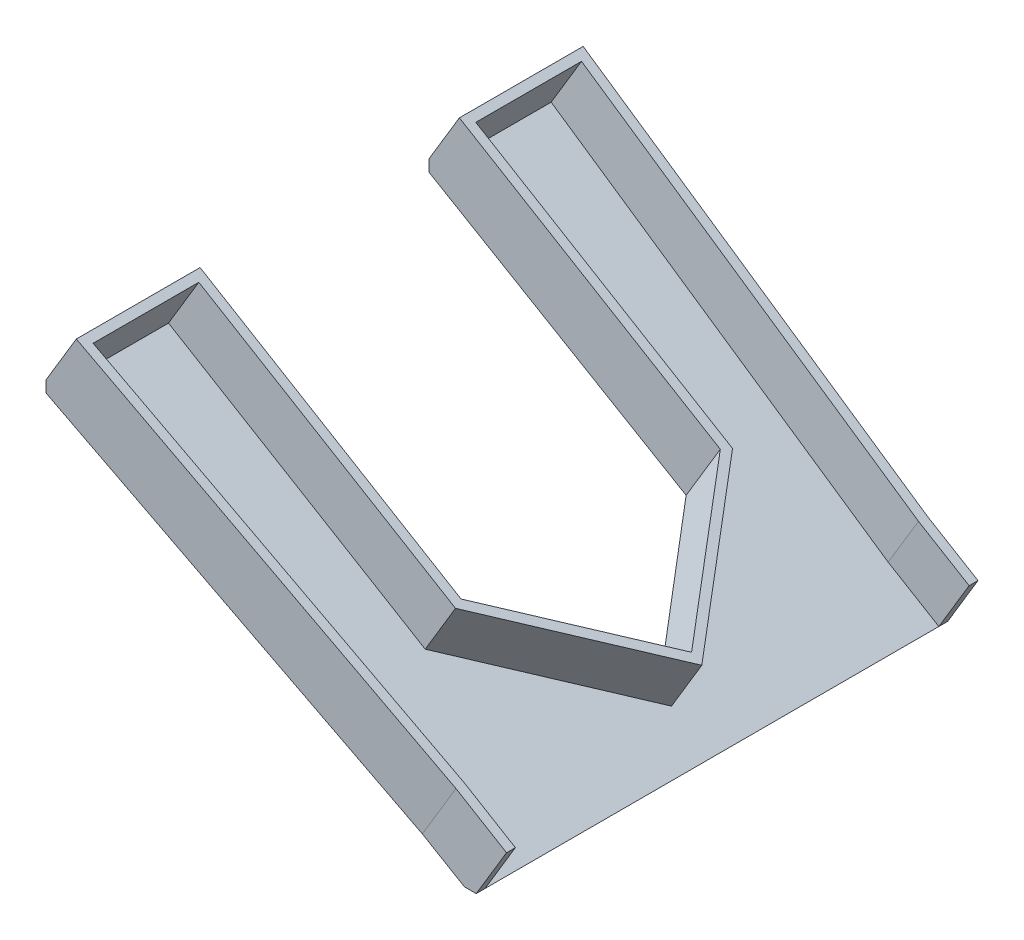
ISO-10303-21;
HEADER;
FILE_DESCRIPTION(('STEP AP214'),'2;1');
FILE_NAME('part.step','',(''),(''),'','','');
FILE_SCHEMA(('AUTOMOTIVE_DESIGN { 1 0 10303 214 1 1 1 1 }'));
ENDSEC;
DATA;
#1=APPLICATION_CONTEXT('core data for automotive mechanical design processes');
#2=APPLICATION_PROTOCOL_DEFINITION('international standard','automotive_design',2000,#1);
#3=PRODUCT_CONTEXT('',#1,'mechanical');
#4=PRODUCT('Part','Part','',(#3));
#5=PRODUCT_RELATED_PRODUCT_CATEGORY('part','',(#4));
#6=PRODUCT_DEFINITION_FORMATION('','',#4);
#7=PRODUCT_DEFINITION_CONTEXT('part definition',#1,'design');
#8=PRODUCT_DEFINITION('design','',#6,#7);
#9=PRODUCT_DEFINITION_SHAPE('','',#8);
#10=(LENGTH_UNIT() NAMED_UNIT(*) SI_UNIT(.MILLI.,.METRE.));
#11=(NAMED_UNIT(*) PLANE_ANGLE_UNIT() SI_UNIT($,.RADIAN.));
#12=(NAMED_UNIT(*) SI_UNIT($,.STERADIAN.) SOLID_ANGLE_UNIT());
#13=UNCERTAINTY_MEASURE_WITH_UNIT(LENGTH_MEASURE(1.E-05),#10,'distance_accuracy_value','');
#14=(GEOMETRIC_REPRESENTATION_CONTEXT(3) GLOBAL_UNCERTAINTY_ASSIGNED_CONTEXT((#13)) GLOBAL_UNIT_ASSIGNED_CONTEXT((#10,
#11,#12)) REPRESENTATION_CONTEXT('',''));
#15=CARTESIAN_POINT('',(0.,0.,0.));
#16=DIRECTION('',(0.,0.,1.));
#17=DIRECTION('',(1.,0.,0.));
#18=AXIS2_PLACEMENT_3D('',#15,#16,#17);
#19=CARTESIAN_POINT('',(7.5,12.5,86.));
#20=DIRECTION('',(0.514495755427526,0.857492925712544,0.));
#21=DIRECTION('',(-0.857492925712544,0.514495755427526,0.));
#22=AXIS2_PLACEMENT_3D('',#19,#20,#21);
#23=PLANE('',#22);
#24=DIRECTION('',(0.,0.,-1.));
#25=VECTOR('',#24,1.);
#26=CARTESIAN_POINT('',(35.,-3.99999999999998,86.));
#27=LINE('',#26,#25);
#28=CARTESIAN_POINT('',(35.,-3.99999999999998,81.5));
#29=VERTEX_POINT('',#28);
#30=CARTESIAN_POINT('',(35.,-3.99999999999998,4.5));
#31=VERTEX_POINT('',#30);
#32=EDGE_CURVE('E265',#29,#31,#27,.T.);
#33=ORIENTED_EDGE('',*,*,#32,.T.);
#34=DIRECTION('',(0.857492925712544,-0.514495755427526,0.));
#35=VECTOR('',#34,1.);
#36=CARTESIAN_POINT('',(7.5,12.5,4.5));
#37=LINE('',#36,#35);
#38=CARTESIAN_POINT('',(26.3981487230941,1.16111076614357,4.50000000000002));
#39=VERTEX_POINT('',#38);
#40=EDGE_CURVE('E52',#39,#31,#37,.T.);
#41=ORIENTED_EDGE('',*,*,#40,.F.);
#42=DIRECTION('',(0.856741922166391,-0.514045153299834,0.0418432691312338));
#43=VECTOR('',#42,1.);
#44=CARTESIAN_POINT('',(7.37176802430439,12.5769391854174,3.5707517076325));
#45=LINE('',#44,#43);
#46=CARTESIAN_POINT('',(-33.7137606114312,37.2282563668587,1.56413479345492));
#47=VERTEX_POINT('',#46);
#48=EDGE_CURVE('E225',#47,#39,#45,.T.);
#49=ORIENTED_EDGE('',*,*,#48,.F.);
#50=DIRECTION('',(0.,0.,-1.));
#51=VECTOR('',#50,1.);
#52=CARTESIAN_POINT('',(-33.7137606114312,37.2282563668587,0.));
#53=LINE('',#52,#51);
#54=CARTESIAN_POINT('',(-33.7137606114312,37.2282563668587,19.5));
#55=VERTEX_POINT('',#54);
#56=EDGE_CURVE('E222',#55,#47,#53,.T.);
#57=ORIENTED_EDGE('',*,*,#56,.F.);
#58=DIRECTION('',(-0.857492925712544,0.514495755427526,0.));
#59=VECTOR('',#58,1.);
#60=CARTESIAN_POINT('',(7.5,12.5,19.5));
#61=LINE('',#60,#59);
#62=CARTESIAN_POINT('',(9.8448071707581,11.0931156975452,19.5));
#63=VERTEX_POINT('',#62);
#64=EDGE_CURVE('E328',#63,#55,#61,.T.);
#65=ORIENTED_EDGE('',*,*,#64,.F.);
#66=DIRECTION('',(-0.576315870033461,0.345789522020077,-0.740465815827241));
#67=VECTOR('',#66,1.);
#68=CARTESIAN_POINT('',(0.464160525834771,16.7215036844991,7.44749800917869));
#69=LINE('',#68,#67);
#70=CARTESIAN_POINT('',(28.1352166080334,0.118870035179973,43.));
#71=VERTEX_POINT('',#70);
#72=EDGE_CURVE('E325',#71,#63,#69,.T.);
#73=ORIENTED_EDGE('',*,*,#72,.F.);
#74=DIRECTION('',(0.576315870033462,-0.345789522020077,-0.740465815827241));
#75=VECTOR('',#74,1.);
#76=CARTESIAN_POINT('',(37.1639898013869,-5.29839388083211,31.399594291673));
#77=LINE('',#76,#75);
#78=CARTESIAN_POINT('',(9.84480717075805,11.0931156975452,66.5));
#79=VERTEX_POINT('',#78);
#80=EDGE_CURVE('E322',#79,#71,#77,.T.);
#81=ORIENTED_EDGE('',*,*,#80,.F.);
#82=DIRECTION('',(0.857492925712544,-0.514495755427526,0.));
#83=VECTOR('',#82,1.);
#84=CARTESIAN_POINT('',(7.5,12.5,66.5));
#85=LINE('',#84,#83);
#86=CARTESIAN_POINT('',(-33.7137606114312,37.2282563668587,66.5));
#87=VERTEX_POINT('',#86);
#88=EDGE_CURVE('E319',#87,#79,#85,.T.);
#89=ORIENTED_EDGE('',*,*,#88,.F.);
#90=DIRECTION('',(0.,0.,-1.));
#91=VECTOR('',#90,1.);
#92=CARTESIAN_POINT('',(-33.7137606114312,37.2282563668587,0.));
#93=LINE('',#92,#91);
#94=CARTESIAN_POINT('',(-33.7137606114312,37.2282563668587,84.4358652065451));
#95=VERTEX_POINT('',#94);
#96=EDGE_CURVE('E316',#95,#87,#93,.T.);
#97=ORIENTED_EDGE('',*,*,#96,.F.);
#98=DIRECTION('',(-0.856741922166391,0.514045153299834,0.0418432691312339));
#99=VECTOR('',#98,1.);
#100=CARTESIAN_POINT('',(10.4547719472732,10.7271368316361,82.2786744036108));
#101=LINE('',#100,#99);
#102=CARTESIAN_POINT('',(26.3981487230941,1.16111076614353,81.5));
#103=VERTEX_POINT('',#102);
#104=EDGE_CURVE('E59',#103,#95,#101,.T.);
#105=ORIENTED_EDGE('',*,*,#104,.F.);
#106=DIRECTION('',(-0.857492925712544,0.514495755427526,0.));
#107=VECTOR('',#106,1.);
#108=CARTESIAN_POINT('',(7.5,12.5,81.5));
#109=LINE('',#108,#107);
#110=EDGE_CURVE('E309',#29,#103,#109,.T.);
#111=ORIENTED_EDGE('',*,*,#110,.F.);
#112=EDGE_LOOP('',(#33,#41,#49,#57,#65,#73,#81,#89,#97,#105,#111));
#113=FACE_BOUND('',#112,.T.);
#114=ADVANCED_FACE('F37',(#113),#23,.T.);
#115=CARTESIAN_POINT('',(-35.,0.,86.));
#116=DIRECTION('',(-1.,0.,0.));
#117=DIRECTION('',(0.,0.,1.));
#118=AXIS2_PLACEMENT_3D('',#115,#116,#117);
#119=PLANE('',#118);
#120=DIRECTION('',(0.,0.,-1.));
#121=VECTOR('',#120,1.);
#122=CARTESIAN_POINT('',(-35.,36.,86.));
#123=LINE('',#122,#121);
#124=CARTESIAN_POINT('',(-35.,36.,85.9569058888901));
#125=VERTEX_POINT('',#124);
#126=CARTESIAN_POINT('',(-35.,36.,65.));
#127=VERTEX_POINT('',#126);
#128=EDGE_CURVE('E259',#125,#127,#123,.T.);
#129=ORIENTED_EDGE('',*,*,#128,.F.);
#130=DIRECTION('',(0.,0.999767942999133,0.0215420554098808));
#131=VECTOR('',#130,1.);
#132=CARTESIAN_POINT('',(-35.,0.0176342857487303,85.1815918558458));
#133=LINE('',#132,#131);
#134=CARTESIAN_POINT('',(-35.,38.,86.));
#135=VERTEX_POINT('',#134);
#136=EDGE_CURVE('E235',#125,#135,#133,.T.);
#137=ORIENTED_EDGE('',*,*,#136,.T.);
#138=DIRECTION('',(0.,0.,-1.));
#139=VECTOR('',#138,1.);
#140=CARTESIAN_POINT('',(-35.,38.,86.));
#141=LINE('',#140,#139);
#142=CARTESIAN_POINT('',(-35.,38.,65.));
#143=VERTEX_POINT('',#142);
#144=EDGE_CURVE('E262',#135,#143,#141,.T.);
#145=ORIENTED_EDGE('',*,*,#144,.T.);
#146=DIRECTION('',(0.,-1.,0.));
#147=VECTOR('',#146,1.);
#148=CARTESIAN_POINT('',(-35.,0.,65.));
#149=LINE('',#148,#147);
#150=EDGE_CURVE('E245',#143,#127,#149,.T.);
#151=ORIENTED_EDGE('',*,*,#150,.T.);
#152=EDGE_LOOP('',(#129,#137,#145,#151));
#153=FACE_BOUND('',#152,.T.);
#154=ADVANCED_FACE('F479',(#153),#119,.T.);
#155=CARTESIAN_POINT('',(6.73521850899743,11.4498714652956,86.));
#156=DIRECTION('',(0.507020126563394,0.86193421515777,0.));
#157=DIRECTION('',(-0.861934215157769,0.507020126563394,0.));
#158=AXIS2_PLACEMENT_3D('',#155,#156,#157);
#159=PLANE('',#158);
#160=DIRECTION('',(0.861934215157769,-0.507020126563394,0.));
#161=VECTOR('',#160,1.);
#162=CARTESIAN_POINT('',(6.73521850899743,11.4498714652956,83.));
#163=LINE('',#162,#161);
#164=CARTESIAN_POINT('',(25.8585928510982,0.200827734648122,83.));
#165=VERTEX_POINT('',#164);
#166=CARTESIAN_POINT('',(33.,-3.99999999999999,83.));
#167=VERTEX_POINT('',#166);
#168=EDGE_CURVE('E228',#165,#167,#163,.T.);
#169=ORIENTED_EDGE('',*,*,#168,.F.);
#170=DIRECTION('',(0.861179378873601,-0.506576105219765,-0.0418416900142982));
#171=VECTOR('',#170,1.);
#172=CARTESIAN_POINT('',(6.66059871538132,11.4937654615404,83.932763300224));
#173=LINE('',#172,#171);
#174=EDGE_CURVE('E11',#125,#165,#173,.T.);
#175=ORIENTED_EDGE('',*,*,#174,.F.);
#176=ORIENTED_EDGE('',*,*,#128,.T.);
#177=DIRECTION('',(-0.861934215157769,0.507020126563394,0.));
#178=VECTOR('',#177,1.);
#179=CARTESIAN_POINT('',(6.73521850899743,11.4498714652956,65.));
#180=LINE('',#179,#178);
#181=CARTESIAN_POINT('',(8.6192568141643,10.3416136387269,65.));
#182=VERTEX_POINT('',#181);
#183=EDGE_CURVE('E283',#182,#127,#180,.T.);
#184=ORIENTED_EDGE('',*,*,#183,.F.);
#185=DIRECTION('',(0.579312842081763,-0.340772260048096,-0.740453170552239));
#186=VECTOR('',#185,1.);
#187=CARTESIAN_POINT('',(-1.23985276185767,16.1410898599163,77.6014968322713));
#188=LINE('',#187,#186);
#189=CARTESIAN_POINT('',(25.831530368606,0.216746841996492,43.));
#190=VERTEX_POINT('',#189);
#191=EDGE_CURVE('E280',#182,#190,#188,.T.);
#192=ORIENTED_EDGE('',*,*,#191,.T.);
#193=DIRECTION('',(0.579312842081763,-0.340772260048096,0.740453170552239));
#194=VECTOR('',#193,1.);
#195=CARTESIAN_POINT('',(35.6501938749944,-5.55893757352608,55.5498003768829));
#196=LINE('',#195,#194);
#197=CARTESIAN_POINT('',(8.61925681416431,10.3416136387269,21.));
#198=VERTEX_POINT('',#197);
#199=EDGE_CURVE('E278',#198,#190,#196,.T.);
#200=ORIENTED_EDGE('',*,*,#199,.F.);
#201=DIRECTION('',(-0.861934215157769,0.507020126563394,0.));
#202=VECTOR('',#201,1.);
#203=CARTESIAN_POINT('',(6.73521850899743,11.4498714652956,21.));
#204=LINE('',#203,#202);
#205=CARTESIAN_POINT('',(-35.,36.,21.));
#206=VERTEX_POINT('',#205);
#207=EDGE_CURVE('E275',#198,#206,#204,.T.);
#208=ORIENTED_EDGE('',*,*,#207,.T.);
#209=CARTESIAN_POINT('',(-35.,36.,0.0430941111099524));
#210=VERTEX_POINT('',#209);
#211=EDGE_CURVE('E258',#206,#210,#123,.T.);
#212=ORIENTED_EDGE('',*,*,#211,.T.);
#213=DIRECTION('',(0.861179378873601,-0.506576105219765,0.0418416900142982));
#214=VECTOR('',#213,1.);
#215=CARTESIAN_POINT('',(9.75945396848933,9.6709094303004,2.21779922377575));
#216=LINE('',#215,#214);
#217=CARTESIAN_POINT('',(25.858592851098,0.200827734648242,3.));
#218=VERTEX_POINT('',#217);
#219=EDGE_CURVE('E269',#210,#218,#216,.T.);
#220=ORIENTED_EDGE('',*,*,#219,.T.);
#221=DIRECTION('',(0.861934215157769,-0.507020126563394,0.));
#222=VECTOR('',#221,1.);
#223=CARTESIAN_POINT('',(6.73521850899743,11.4498714652956,3.));
#224=LINE('',#223,#222);
#225=CARTESIAN_POINT('',(33.,-3.99999999999999,3.));
#226=VERTEX_POINT('',#225);
#227=EDGE_CURVE('E272',#218,#226,#224,.T.);
#228=ORIENTED_EDGE('',*,*,#227,.T.);
#229=DIRECTION('',(0.,0.,-1.));
#230=VECTOR('',#229,1.);
#231=CARTESIAN_POINT('',(33.,-3.99999999999999,86.));
#232=LINE('',#231,#230);
#233=EDGE_CURVE('E256',#167,#226,#232,.T.);
#234=ORIENTED_EDGE('',*,*,#233,.F.);
#235=EDGE_LOOP('',(#169,#175,#176,#184,#192,#200,#208,#212,#220,#228,#234));
#236=FACE_BOUND('',#235,.T.);
#237=ADVANCED_FACE('F295',(#236),#159,.F.);
#238=CARTESIAN_POINT('',(0.,-3.99999999999998,86.));
#239=DIRECTION('',(0.,-1.,0.));
#240=DIRECTION('',(0.,0.,-1.));
#241=AXIS2_PLACEMENT_3D('',#238,#239,#240);
#242=PLANE('',#241);
#243=CARTESIAN_POINT('',(35.,-3.99999999999997,83.));
#244=VERTEX_POINT('',#243);
#245=EDGE_CURVE('E266',#244,#29,#27,.T.);
#246=ORIENTED_EDGE('',*,*,#245,.F.);
#247=DIRECTION('',(-1.,0.,0.));
#248=VECTOR('',#247,1.);
#249=CARTESIAN_POINT('',(0.,-3.99999999999998,83.));
#250=LINE('',#249,#248);
#251=EDGE_CURVE('E45',#244,#167,#250,.T.);
#252=ORIENTED_EDGE('',*,*,#251,.T.);
#253=ORIENTED_EDGE('',*,*,#233,.T.);
#254=DIRECTION('',(-1.,0.,0.));
#255=VECTOR('',#254,1.);
#256=CARTESIAN_POINT('',(0.,-3.99999999999998,3.));
#257=LINE('',#256,#255);
#258=CARTESIAN_POINT('',(35.,-3.99999999999997,3.));
#259=VERTEX_POINT('',#258);
#260=EDGE_CURVE('E253',#259,#226,#257,.T.);
#261=ORIENTED_EDGE('',*,*,#260,.F.);
#262=DIRECTION('',(0.,0.,-1.));
#263=VECTOR('',#262,1.);
#264=CARTESIAN_POINT('',(35.,-3.99999999999998,0.));
#265=LINE('',#264,#263);
#266=EDGE_CURVE('E306',#31,#259,#265,.T.);
#267=ORIENTED_EDGE('',*,*,#266,.F.);
#268=ORIENTED_EDGE('',*,*,#32,.F.);
#269=EDGE_LOOP('',(#246,#252,#253,#261,#267,#268));
#270=FACE_BOUND('',#269,.T.);
#271=ADVANCED_FACE('F39',(#270),#242,.T.);
#272=DIRECTION('',(0.,-1.,0.));
#273=VECTOR('',#272,1.);
#274=CARTESIAN_POINT('',(-35.,0.,21.));
#275=LINE('',#274,#273);
#276=CARTESIAN_POINT('',(-35.,38.,21.));
#277=VERTEX_POINT('',#276);
#278=EDGE_CURVE('E240',#277,#206,#275,.T.);
#279=ORIENTED_EDGE('',*,*,#278,.F.);
#280=CARTESIAN_POINT('',(-35.,38.,0.));
#281=VERTEX_POINT('',#280);
#282=EDGE_CURVE('E261',#277,#281,#141,.T.);
#283=ORIENTED_EDGE('',*,*,#282,.T.);
#284=DIRECTION('',(0.,0.999767942999133,-0.0215420554098808));
#285=VECTOR('',#284,1.);
#286=CARTESIAN_POINT('',(-35.,-1.83455256681072,0.858317317164459));
#287=LINE('',#286,#285);
#288=EDGE_CURVE('E250',#210,#281,#287,.T.);
#289=ORIENTED_EDGE('',*,*,#288,.F.);
#290=ORIENTED_EDGE('',*,*,#211,.F.);
#291=EDGE_LOOP('',(#279,#283,#289,#290));
#292=FACE_BOUND('',#291,.T.);
#293=ADVANCED_FACE('F386',(#292),#119,.T.);
#294=CARTESIAN_POINT('',(5.95651273371742,9.92752122286238,3.));
#295=DIRECTION('',(0.,0.,1.));
#296=DIRECTION('',(1.,0.,0.));
#297=AXIS2_PLACEMENT_3D('',#294,#295,#296);
#298=PLANE('',#297);
#299=ORIENTED_EDGE('',*,*,#260,.T.);
#300=ORIENTED_EDGE('',*,*,#227,.F.);
#301=DIRECTION('',(0.514495755427526,0.857492925712544,0.));
#302=VECTOR('',#301,1.);
#303=CARTESIAN_POINT('',(24.881583476592,-1.42752122286233,3.));
#304=LINE('',#303,#302);
#305=CARTESIAN_POINT('',(31.5700282971498,9.71988681140072,3.));
#306=VERTEX_POINT('',#305);
#307=EDGE_CURVE('E248',#218,#306,#304,.T.);
#308=ORIENTED_EDGE('',*,*,#307,.T.);
#309=DIRECTION('',(-0.857492925712544,0.514495755427526,0.));
#310=VECTOR('',#309,1.);
#311=CARTESIAN_POINT('',(12.6449575542753,21.0749292571254,3.));
#312=LINE('',#311,#310);
#313=CARTESIAN_POINT('',(40.1449575542753,4.57492925712546,3.));
#314=VERTEX_POINT('',#313);
#315=EDGE_CURVE('E780',#314,#306,#312,.T.);
#316=ORIENTED_EDGE('',*,*,#315,.F.);
#317=DIRECTION('',(-0.514495755427526,-0.857492925712544,0.));
#318=VECTOR('',#317,1.);
#319=CARTESIAN_POINT('',(40.1449575542753,4.57492925712546,3.));
#320=LINE('',#319,#318);
#321=EDGE_CURVE('E230',#314,#259,#320,.T.);
#322=ORIENTED_EDGE('',*,*,#321,.T.);
#323=EDGE_LOOP('',(#299,#300,#308,#316,#322));
#324=FACE_BOUND('',#323,.T.);
#325=ADVANCED_FACE('F300',(#324),#298,.F.);
#326=CARTESIAN_POINT('',(5.8821012189249,9.97216813173789,2.07206542729765));
#327=DIRECTION('',(-0.035880307268719,0.0215281843612314,0.999124186889904));
#328=DIRECTION('',(0.99935579580717,0.,0.035888624752398));
#329=AXIS2_PLACEMENT_3D('',#326,#327,#328);
#330=PLANE('',#329);
#331=ORIENTED_EDGE('',*,*,#288,.T.);
#332=DIRECTION('',(-0.514495755427526,-0.857492925712544,0.));
#333=VECTOR('',#332,1.);
#334=CARTESIAN_POINT('',(-29.8550424457247,46.5749292571254,0.));
#335=LINE('',#334,#333);
#336=CARTESIAN_POINT('',(-29.8550424457247,46.5749292571254,0.));
#337=VERTEX_POINT('',#336);
#338=EDGE_CURVE('E370',#337,#281,#335,.T.);
#339=ORIENTED_EDGE('',*,*,#338,.F.);
#340=DIRECTION('',(-0.856741922166391,0.514045153299834,-0.0418432691312338));
#341=VECTOR('',#340,1.);
#342=CARTESIAN_POINT('',(12.5705460394827,21.119576166001,2.07206542729765));
#343=LINE('',#342,#341);
#344=EDGE_CURVE('E382',#306,#337,#343,.T.);
#345=ORIENTED_EDGE('',*,*,#344,.F.);
#346=ORIENTED_EDGE('',*,*,#307,.F.);
#347=ORIENTED_EDGE('',*,*,#219,.F.);
#348=EDGE_LOOP('',(#331,#339,#345,#346,#347));
#349=FACE_BOUND('',#348,.T.);
#350=ADVANCED_FACE('F381',(#349),#330,.F.);
#351=CARTESIAN_POINT('',(-2.03174303865356,14.720474686285,8.45563904349902));
#352=DIRECTION('',(-0.634944198803826,0.380966519282296,0.672094022880206));
#353=DIRECTION('',(0.726911247971551,0.,0.686731415891571));
#354=AXIS2_PLACEMENT_3D('',#351,#352,#353);
#355=PLANE('',#354);
#356=ORIENTED_EDGE('',*,*,#199,.T.);
#357=DIRECTION('',(0.514495755427526,0.857492925712544,0.));
#358=VECTOR('',#357,1.);
#359=CARTESIAN_POINT('',(24.8546614568116,-1.41136801099412,43.));
#360=LINE('',#359,#358);
#361=CARTESIAN_POINT('',(31.5431062773694,9.73604002326895,43.));
#362=VERTEX_POINT('',#361);
#363=EDGE_CURVE('E238',#190,#362,#360,.T.);
#364=ORIENTED_EDGE('',*,*,#363,.T.);
#365=DIRECTION('',(0.576315870033462,-0.345789522020077,0.740465815827241));
#366=VECTOR('',#365,1.);
#367=CARTESIAN_POINT('',(4.65670178190429,25.867882720548,8.45563904349902));
#368=LINE('',#367,#366);
#369=CARTESIAN_POINT('',(14.4201697828989,20.0098019199513,21.));
#370=VERTEX_POINT('',#369);
#371=EDGE_CURVE('E406',#370,#362,#368,.T.);
#372=ORIENTED_EDGE('',*,*,#371,.F.);
#373=DIRECTION('',(0.514495755427526,0.857492925712544,0.));
#374=VECTOR('',#373,1.);
#375=CARTESIAN_POINT('',(7.73172496234109,8.86239388568818,21.));
#376=LINE('',#375,#374);
#377=EDGE_CURVE('E237',#198,#370,#376,.T.);
#378=ORIENTED_EDGE('',*,*,#377,.F.);
#379=EDGE_LOOP('',(#356,#364,#372,#378));
#380=FACE_BOUND('',#379,.T.);
#381=ADVANCED_FACE('F395',(#380),#355,.T.);
#382=CARTESIAN_POINT('',(34.6680862368986,-7.2994228790463,30.3914532573527));
#383=DIRECTION('',(0.634944198803826,-0.380966519282296,0.672094022880206));
#384=DIRECTION('',(0.726911247971551,0.,-0.686731415891571));
#385=AXIS2_PLACEMENT_3D('',#382,#383,#384);
#386=PLANE('',#385);
#387=DIRECTION('',(0.514495755427526,0.857492925712544,0.));
#388=VECTOR('',#387,1.);
#389=CARTESIAN_POINT('',(7.73172496234107,8.86239388568819,65.));
#390=LINE('',#389,#388);
#391=CARTESIAN_POINT('',(14.4201697828989,20.0098019199513,65.));
#392=VERTEX_POINT('',#391);
#393=EDGE_CURVE('E241',#182,#392,#390,.T.);
#394=ORIENTED_EDGE('',*,*,#393,.T.);
#395=DIRECTION('',(-0.576315870033462,0.345789522020077,0.740465815827241));
#396=VECTOR('',#395,1.);
#397=CARTESIAN_POINT('',(41.3565310574564,3.84798515521677,30.3914532573527));
#398=LINE('',#397,#396);
#399=EDGE_CURVE('E403',#362,#392,#398,.T.);
#400=ORIENTED_EDGE('',*,*,#399,.F.);
#401=ORIENTED_EDGE('',*,*,#363,.F.);
#402=ORIENTED_EDGE('',*,*,#191,.F.);
#403=EDGE_LOOP('',(#394,#400,#401,#402));
#404=FACE_BOUND('',#403,.T.);
#405=ADVANCED_FACE('F400',(#404),#386,.F.);
#406=CARTESIAN_POINT('',(5.95651273371742,9.92752122286238,65.));
#407=DIRECTION('',(0.,0.,-1.));
#408=DIRECTION('',(-1.,0.,0.));
#409=AXIS2_PLACEMENT_3D('',#406,#407,#408);
#410=PLANE('',#409);
#411=ORIENTED_EDGE('',*,*,#150,.F.);
#412=DIRECTION('',(-0.514495755427526,-0.857492925712544,0.));
#413=VECTOR('',#412,1.);
#414=CARTESIAN_POINT('',(-29.8550424457247,46.5749292571254,65.));
#415=LINE('',#414,#413);
#416=CARTESIAN_POINT('',(-29.8550424457247,46.5749292571254,65.));
#417=VERTEX_POINT('',#416);
#418=EDGE_CURVE('E364',#417,#143,#415,.T.);
#419=ORIENTED_EDGE('',*,*,#418,.F.);
#420=DIRECTION('',(-0.857492925712544,0.514495755427526,0.));
#421=VECTOR('',#420,1.);
#422=CARTESIAN_POINT('',(12.6449575542753,21.0749292571254,65.));
#423=LINE('',#422,#421);
#424=EDGE_CURVE('E405',#392,#417,#423,.T.);
#425=ORIENTED_EDGE('',*,*,#424,.F.);
#426=ORIENTED_EDGE('',*,*,#393,.F.);
#427=ORIENTED_EDGE('',*,*,#183,.T.);
#428=EDGE_LOOP('',(#411,#419,#425,#426,#427));
#429=FACE_BOUND('',#428,.T.);
#430=ADVANCED_FACE('F483',(#429),#410,.T.);
#431=CARTESIAN_POINT('',(5.95651273371742,9.92752122286238,21.));
#432=DIRECTION('',(0.,0.,-1.));
#433=DIRECTION('',(-1.,0.,0.));
#434=AXIS2_PLACEMENT_3D('',#431,#432,#433);
#435=PLANE('',#434);
#436=ORIENTED_EDGE('',*,*,#278,.T.);
#437=ORIENTED_EDGE('',*,*,#207,.F.);
#438=ORIENTED_EDGE('',*,*,#377,.T.);
#439=DIRECTION('',(0.857492925712544,-0.514495755427526,0.));
#440=VECTOR('',#439,1.);
#441=CARTESIAN_POINT('',(12.6449575542753,21.0749292571254,21.));
#442=LINE('',#441,#440);
#443=CARTESIAN_POINT('',(-29.8550424457248,46.5749292571254,21.));
#444=VERTEX_POINT('',#443);
#445=EDGE_CURVE('E410',#444,#370,#442,.T.);
#446=ORIENTED_EDGE('',*,*,#445,.F.);
#447=DIRECTION('',(-0.514495755427526,-0.857492925712544,0.));
#448=VECTOR('',#447,1.);
#449=CARTESIAN_POINT('',(-29.8550424457248,46.5749292571254,21.));
#450=LINE('',#449,#448);
#451=EDGE_CURVE('E367',#444,#277,#450,.T.);
#452=ORIENTED_EDGE('',*,*,#451,.T.);
#453=EDGE_LOOP('',(#436,#437,#438,#446,#452));
#454=FACE_BOUND('',#453,.T.);
#455=ADVANCED_FACE('F388',(#454),#435,.F.);
#456=CARTESIAN_POINT('',(5.95651273371742,9.92752122286238,83.));
#457=DIRECTION('',(0.,0.,1.));
#458=DIRECTION('',(1.,0.,0.));
#459=AXIS2_PLACEMENT_3D('',#456,#457,#458);
#460=PLANE('',#459);
#461=ORIENTED_EDGE('',*,*,#168,.T.);
#462=ORIENTED_EDGE('',*,*,#251,.F.);
#463=DIRECTION('',(-0.514495755427526,-0.857492925712544,0.));
#464=VECTOR('',#463,1.);
#465=CARTESIAN_POINT('',(40.1449575542753,4.57492925712546,83.));
#466=LINE('',#465,#464);
#467=CARTESIAN_POINT('',(40.1449575542753,4.57492925712546,83.));
#468=VERTEX_POINT('',#467);
#469=EDGE_CURVE('E359',#468,#244,#466,.T.);
#470=ORIENTED_EDGE('',*,*,#469,.F.);
#471=DIRECTION('',(0.857492925712544,-0.514495755427526,0.));
#472=VECTOR('',#471,1.);
#473=CARTESIAN_POINT('',(12.6449575542753,21.0749292571254,83.));
#474=LINE('',#473,#472);
#475=CARTESIAN_POINT('',(31.5700282971498,9.71988681140076,83.));
#476=VERTEX_POINT('',#475);
#477=EDGE_CURVE('E418',#476,#468,#474,.T.);
#478=ORIENTED_EDGE('',*,*,#477,.F.);
#479=DIRECTION('',(0.514495755427526,0.857492925712544,0.));
#480=VECTOR('',#479,1.);
#481=CARTESIAN_POINT('',(24.8815834765919,-1.42752122286232,83.));
#482=LINE('',#481,#480);
#483=EDGE_CURVE('E226',#165,#476,#482,.T.);
#484=ORIENTED_EDGE('',*,*,#483,.F.);
#485=EDGE_LOOP('',(#461,#462,#470,#478,#484));
#486=FACE_BOUND('',#485,.T.);
#487=ADVANCED_FACE('F470',(#486),#460,.T.);
#488=CARTESIAN_POINT('',(8.96510514189371,8.1223657779566,83.7773606839457));
#489=DIRECTION('',(0.035880307268719,-0.0215281843612314,0.999124186889904));
#490=DIRECTION('',(0.99935579580717,0.,-0.035888624752398));
#491=AXIS2_PLACEMENT_3D('',#488,#489,#490);
#492=PLANE('',#491);
#493=ORIENTED_EDGE('',*,*,#174,.T.);
#494=ORIENTED_EDGE('',*,*,#483,.T.);
#495=DIRECTION('',(0.856741922166391,-0.514045153299834,-0.0418432691312338));
#496=VECTOR('',#495,1.);
#497=CARTESIAN_POINT('',(15.6535499624516,19.2697738122197,83.7773606839457));
#498=LINE('',#497,#496);
#499=CARTESIAN_POINT('',(-29.8550424457247,46.5749292571254,86.));
#500=VERTEX_POINT('',#499);
#501=EDGE_CURVE('E415',#500,#476,#498,.T.);
#502=ORIENTED_EDGE('',*,*,#501,.F.);
#503=DIRECTION('',(-0.514495755427526,-0.857492925712544,0.));
#504=VECTOR('',#503,1.);
#505=CARTESIAN_POINT('',(-29.8550424457247,46.5749292571254,86.));
#506=LINE('',#505,#504);
#507=EDGE_CURVE('E361',#500,#135,#506,.T.);
#508=ORIENTED_EDGE('',*,*,#507,.T.);
#509=ORIENTED_EDGE('',*,*,#136,.F.);
#510=EDGE_LOOP('',(#493,#494,#502,#508,#509));
#511=FACE_BOUND('',#510,.T.);
#512=ADVANCED_FACE('F476',(#511),#492,.T.);
#513=CARTESIAN_POINT('',(12.5167255785797,21.1518684425428,3.5707517076325));
#514=DIRECTION('',(0.035880307268719,-0.0215281843612314,-0.999124186889903));
#515=DIRECTION('',(-0.99935579580717,0.,-0.035888624752398));
#516=AXIS2_PLACEMENT_3D('',#513,#514,#515);
#517=PLANE('',#516);
#518=ORIENTED_EDGE('',*,*,#48,.T.);
#519=DIRECTION('',(-0.514495755427526,-0.857492925712544,0.));
#520=VECTOR('',#519,1.);
#521=CARTESIAN_POINT('',(31.5431062773693,9.73604002326902,4.5));
#522=LINE('',#521,#520);
#523=CARTESIAN_POINT('',(31.5431062773693,9.73604002326902,4.5));
#524=VERTEX_POINT('',#523);
#525=EDGE_CURVE('E206',#524,#39,#522,.T.);
#526=ORIENTED_EDGE('',*,*,#525,.F.);
#527=DIRECTION('',(0.856741922166391,-0.514045153299834,0.0418432691312338));
#528=VECTOR('',#527,1.);
#529=CARTESIAN_POINT('',(12.5167255785797,21.1518684425428,3.5707517076325));
#530=LINE('',#529,#528);
#531=CARTESIAN_POINT('',(-28.5688030571559,45.8031856239842,1.56413479345492));
#532=VERTEX_POINT('',#531);
#533=EDGE_CURVE('E213',#532,#524,#530,.T.);
#534=ORIENTED_EDGE('',*,*,#533,.F.);
#535=DIRECTION('',(-0.514495755427526,-0.857492925712544,0.));
#536=VECTOR('',#535,1.);
#537=CARTESIAN_POINT('',(-28.5688030571559,45.8031856239842,1.56413479345492));
#538=LINE('',#537,#536);
#539=EDGE_CURVE('E333',#532,#47,#538,.T.);
#540=ORIENTED_EDGE('',*,*,#539,.T.);
#541=EDGE_LOOP('',(#518,#526,#534,#540));
#542=FACE_BOUND('',#541,.T.);
#543=ADVANCED_FACE('F224',(#542),#517,.F.);
#544=CARTESIAN_POINT('',(12.6449575542753,21.0749292571254,4.5));
#545=DIRECTION('',(0.,0.,-1.));
#546=DIRECTION('',(-1.,0.,0.));
#547=AXIS2_PLACEMENT_3D('',#544,#545,#546);
#548=PLANE('',#547);
#549=ORIENTED_EDGE('',*,*,#40,.T.);
#550=DIRECTION('',(-0.514495755427526,-0.857492925712544,0.));
#551=VECTOR('',#550,1.);
#552=CARTESIAN_POINT('',(40.1449575542753,4.57492925712546,4.5));
#553=LINE('',#552,#551);
#554=CARTESIAN_POINT('',(40.1449575542753,4.57492925712546,4.5));
#555=VERTEX_POINT('',#554);
#556=EDGE_CURVE('E209',#555,#31,#553,.T.);
#557=ORIENTED_EDGE('',*,*,#556,.F.);
#558=DIRECTION('',(0.857492925712544,-0.514495755427526,0.));
#559=VECTOR('',#558,1.);
#560=CARTESIAN_POINT('',(12.6449575542753,21.0749292571254,4.5));
#561=LINE('',#560,#559);
#562=EDGE_CURVE('E202',#524,#555,#561,.T.);
#563=ORIENTED_EDGE('',*,*,#562,.F.);
#564=ORIENTED_EDGE('',*,*,#525,.T.);
#565=EDGE_LOOP('',(#549,#557,#563,#564));
#566=FACE_BOUND('',#565,.T.);
#567=ADVANCED_FACE('F204',(#566),#548,.F.);
#568=CARTESIAN_POINT('',(40.1449575542753,4.57492925712546,0.));
#569=DIRECTION('',(-0.857492925712544,0.514495755427526,0.));
#570=DIRECTION('',(-0.514495755427526,-0.857492925712544,0.));
#571=AXIS2_PLACEMENT_3D('',#568,#569,#570);
#572=PLANE('',#571);
#573=ORIENTED_EDGE('',*,*,#266,.T.);
#574=ORIENTED_EDGE('',*,*,#321,.F.);
#575=DIRECTION('',(0.,0.,-1.));
#576=VECTOR('',#575,1.);
#577=CARTESIAN_POINT('',(40.1449575542753,4.57492925712546,0.));
#578=LINE('',#577,#576);
#579=EDGE_CURVE('E212',#555,#314,#578,.T.);
#580=ORIENTED_EDGE('',*,*,#579,.F.);
#581=ORIENTED_EDGE('',*,*,#556,.T.);
#582=EDGE_LOOP('',(#573,#574,#580,#581));
#583=FACE_BOUND('',#582,.T.);
#584=ADVANCED_FACE('F308',(#583),#572,.F.);
#585=CARTESIAN_POINT('',(-29.8550424457247,46.5749292571254,0.));
#586=DIRECTION('',(0.857492925712544,-0.514495755427526,0.));
#587=DIRECTION('',(0.514495755427526,0.857492925712544,0.));
#588=AXIS2_PLACEMENT_3D('',#585,#586,#587);
#589=PLANE('',#588);
#590=ORIENTED_EDGE('',*,*,#282,.F.);
#591=ORIENTED_EDGE('',*,*,#451,.F.);
#592=DIRECTION('',(0.,0.,1.));
#593=VECTOR('',#592,1.);
#594=CARTESIAN_POINT('',(-29.8550424457247,46.5749292571254,0.));
#595=LINE('',#594,#593);
#596=EDGE_CURVE('E378',#337,#444,#595,.T.);
#597=ORIENTED_EDGE('',*,*,#596,.F.);
#598=ORIENTED_EDGE('',*,*,#338,.T.);
#599=EDGE_LOOP('',(#590,#591,#597,#598));
#600=FACE_BOUND('',#599,.T.);
#601=ADVANCED_FACE('F376',(#600),#589,.F.);
#602=CARTESIAN_POINT('',(-29.8550424457247,46.5749292571254,0.));
#603=DIRECTION('',(0.857492925712544,-0.514495755427526,0.));
#604=DIRECTION('',(0.514495755427526,0.857492925712544,0.));
#605=AXIS2_PLACEMENT_3D('',#602,#603,#604);
#606=PLANE('',#605);
#607=ORIENTED_EDGE('',*,*,#144,.F.);
#608=ORIENTED_EDGE('',*,*,#507,.F.);
#609=DIRECTION('',(0.,0.,1.));
#610=VECTOR('',#609,1.);
#611=CARTESIAN_POINT('',(-29.8550424457247,46.5749292571254,0.));
#612=LINE('',#611,#610);
#613=EDGE_CURVE('E408',#417,#500,#612,.T.);
#614=ORIENTED_EDGE('',*,*,#613,.F.);
#615=ORIENTED_EDGE('',*,*,#418,.T.);
#616=EDGE_LOOP('',(#607,#608,#614,#615));
#617=FACE_BOUND('',#616,.T.);
#618=ADVANCED_FACE('F485',(#617),#606,.F.);
#619=ORIENTED_EDGE('',*,*,#245,.T.);
#620=DIRECTION('',(-0.514495755427526,-0.857492925712544,0.));
#621=VECTOR('',#620,1.);
#622=CARTESIAN_POINT('',(40.1449575542753,4.57492925712546,81.5));
#623=LINE('',#622,#621);
#624=CARTESIAN_POINT('',(40.1449575542753,4.57492925712546,81.5));
#625=VERTEX_POINT('',#624);
#626=EDGE_CURVE('E356',#625,#29,#623,.T.);
#627=ORIENTED_EDGE('',*,*,#626,.F.);
#628=EDGE_CURVE('E420',#468,#625,#578,.T.);
#629=ORIENTED_EDGE('',*,*,#628,.F.);
#630=ORIENTED_EDGE('',*,*,#469,.T.);
#631=EDGE_LOOP('',(#619,#627,#629,#630));
#632=FACE_BOUND('',#631,.T.);
#633=ADVANCED_FACE('F467',(#632),#572,.F.);
#634=CARTESIAN_POINT('',(12.6449575542753,21.0749292571254,81.5));
#635=DIRECTION('',(0.,0.,1.));
#636=DIRECTION('',(1.,0.,0.));
#637=AXIS2_PLACEMENT_3D('',#634,#635,#636);
#638=PLANE('',#637);
#639=ORIENTED_EDGE('',*,*,#110,.T.);
#640=DIRECTION('',(-0.514495755427526,-0.857492925712544,0.));
#641=VECTOR('',#640,1.);
#642=CARTESIAN_POINT('',(31.5431062773694,9.73604002326898,81.5));
#643=LINE('',#642,#641);
#644=CARTESIAN_POINT('',(31.5431062773694,9.73604002326898,81.5));
#645=VERTEX_POINT('',#644);
#646=EDGE_CURVE('E353',#645,#103,#643,.T.);
#647=ORIENTED_EDGE('',*,*,#646,.F.);
#648=DIRECTION('',(-0.857492925712544,0.514495755427526,0.));
#649=VECTOR('',#648,1.);
#650=CARTESIAN_POINT('',(12.6449575542753,21.0749292571254,81.5));
#651=LINE('',#650,#649);
#652=EDGE_CURVE('E421',#625,#645,#651,.T.);
#653=ORIENTED_EDGE('',*,*,#652,.F.);
#654=ORIENTED_EDGE('',*,*,#626,.T.);
#655=EDGE_LOOP('',(#639,#647,#653,#654));
#656=FACE_BOUND('',#655,.T.);
#657=ADVANCED_FACE('F464',(#656),#638,.F.);
#658=CARTESIAN_POINT('',(15.5997295015485,19.3020660887615,82.2786744036108));
#659=DIRECTION('',(0.0358803072687191,-0.0215281843612314,0.999124186889903));
#660=DIRECTION('',(0.99935579580717,0.,-0.035888624752398));
#661=AXIS2_PLACEMENT_3D('',#658,#659,#660);
#662=PLANE('',#661);
#663=ORIENTED_EDGE('',*,*,#104,.T.);
#664=DIRECTION('',(-0.514495755427526,-0.857492925712544,0.));
#665=VECTOR('',#664,1.);
#666=CARTESIAN_POINT('',(-28.5688030571563,45.8031856239844,84.4358652065451));
#667=LINE('',#666,#665);
#668=CARTESIAN_POINT('',(-28.5688030571563,45.8031856239844,84.4358652065451));
#669=VERTEX_POINT('',#668);
#670=EDGE_CURVE('E350',#669,#95,#667,.T.);
#671=ORIENTED_EDGE('',*,*,#670,.F.);
#672=DIRECTION('',(-0.856741922166391,0.514045153299834,0.0418432691312339));
#673=VECTOR('',#672,1.);
#674=CARTESIAN_POINT('',(15.5997295015485,19.3020660887615,82.2786744036108));
#675=LINE('',#674,#673);
#676=EDGE_CURVE('E423',#645,#669,#675,.T.);
#677=ORIENTED_EDGE('',*,*,#676,.F.);
#678=ORIENTED_EDGE('',*,*,#646,.T.);
#679=EDGE_LOOP('',(#663,#671,#677,#678));
#680=FACE_BOUND('',#679,.T.);
#681=ADVANCED_FACE('F459',(#680),#662,.F.);
#682=CARTESIAN_POINT('',(-28.5688030571559,45.8031856239842,0.));
#683=DIRECTION('',(-0.857492925712544,0.514495755427526,0.));
#684=DIRECTION('',(-0.514495755427526,-0.857492925712544,0.));
#685=AXIS2_PLACEMENT_3D('',#682,#683,#684);
#686=PLANE('',#685);
#687=ORIENTED_EDGE('',*,*,#96,.T.);
#688=DIRECTION('',(-0.514495755427526,-0.857492925712544,0.));
#689=VECTOR('',#688,1.);
#690=CARTESIAN_POINT('',(-28.5688030571559,45.8031856239842,66.5));
#691=LINE('',#690,#689);
#692=CARTESIAN_POINT('',(-28.5688030571559,45.8031856239842,66.5));
#693=VERTEX_POINT('',#692);
#694=EDGE_CURVE('E347',#693,#87,#691,.T.);
#695=ORIENTED_EDGE('',*,*,#694,.F.);
#696=DIRECTION('',(0.,0.,-1.));
#697=VECTOR('',#696,1.);
#698=CARTESIAN_POINT('',(-28.5688030571559,45.8031856239842,0.));
#699=LINE('',#698,#697);
#700=EDGE_CURVE('E425',#669,#693,#699,.T.);
#701=ORIENTED_EDGE('',*,*,#700,.F.);
#702=ORIENTED_EDGE('',*,*,#670,.T.);
#703=EDGE_LOOP('',(#687,#695,#701,#702));
#704=FACE_BOUND('',#703,.T.);
#705=ADVANCED_FACE('F456',(#704),#686,.F.);
#706=CARTESIAN_POINT('',(12.6449575542753,21.0749292571254,66.5));
#707=DIRECTION('',(0.,0.,-1.));
#708=DIRECTION('',(-1.,0.,0.));
#709=AXIS2_PLACEMENT_3D('',#706,#707,#708);
#710=PLANE('',#709);
#711=ORIENTED_EDGE('',*,*,#88,.T.);
#712=DIRECTION('',(-0.514495755427526,-0.857492925712544,0.));
#713=VECTOR('',#712,1.);
#714=CARTESIAN_POINT('',(14.9897647250333,19.6680449546706,66.5));
#715=LINE('',#714,#713);
#716=CARTESIAN_POINT('',(14.9897647250333,19.6680449546706,66.5));
#717=VERTEX_POINT('',#716);
#718=EDGE_CURVE('E344',#717,#79,#715,.T.);
#719=ORIENTED_EDGE('',*,*,#718,.F.);
#720=DIRECTION('',(0.857492925712544,-0.514495755427526,0.));
#721=VECTOR('',#720,1.);
#722=CARTESIAN_POINT('',(12.6449575542753,21.0749292571254,66.5));
#723=LINE('',#722,#721);
#724=EDGE_CURVE('E427',#693,#717,#723,.T.);
#725=ORIENTED_EDGE('',*,*,#724,.F.);
#726=ORIENTED_EDGE('',*,*,#694,.T.);
#727=EDGE_LOOP('',(#711,#719,#725,#726));
#728=FACE_BOUND('',#727,.T.);
#729=ADVANCED_FACE('F451',(#728),#710,.F.);
#730=CARTESIAN_POINT('',(42.3089473556621,3.27653537629333,31.399594291673));
#731=DIRECTION('',(-0.634944198803827,0.380966519282296,-0.672094022880206));
#732=DIRECTION('',(-0.726911247971551,0.,0.686731415891571));
#733=AXIS2_PLACEMENT_3D('',#730,#731,#732);
#734=PLANE('',#733);
#735=ORIENTED_EDGE('',*,*,#80,.T.);
#736=DIRECTION('',(-0.514495755427526,-0.857492925712544,0.));
#737=VECTOR('',#736,1.);
#738=CARTESIAN_POINT('',(33.2801741623087,8.69379929230542,43.));
#739=LINE('',#738,#737);
#740=CARTESIAN_POINT('',(33.2801741623087,8.69379929230542,43.));
#741=VERTEX_POINT('',#740);
#742=EDGE_CURVE('E341',#741,#71,#739,.T.);
#743=ORIENTED_EDGE('',*,*,#742,.F.);
#744=DIRECTION('',(0.576315870033462,-0.345789522020077,-0.740465815827241));
#745=VECTOR('',#744,1.);
#746=CARTESIAN_POINT('',(42.3089473556621,3.27653537629333,31.399594291673));
#747=LINE('',#746,#745);
#748=EDGE_CURVE('E429',#717,#741,#747,.T.);
#749=ORIENTED_EDGE('',*,*,#748,.F.);
#750=ORIENTED_EDGE('',*,*,#718,.T.);
#751=EDGE_LOOP('',(#735,#743,#749,#750));
#752=FACE_BOUND('',#751,.T.);
#753=ADVANCED_FACE('F448',(#752),#734,.F.);
#754=CARTESIAN_POINT('',(5.60911808011003,25.2964329416246,7.44749800917869));
#755=DIRECTION('',(-0.634944198803827,0.380966519282296,0.672094022880206));
#756=DIRECTION('',(0.726911247971551,0.,0.686731415891572));
#757=AXIS2_PLACEMENT_3D('',#754,#755,#756);
#758=PLANE('',#757);
#759=ORIENTED_EDGE('',*,*,#72,.T.);
#760=DIRECTION('',(-0.514495755427526,-0.857492925712544,0.));
#761=VECTOR('',#760,1.);
#762=CARTESIAN_POINT('',(14.9897647250333,19.6680449546706,19.5));
#763=LINE('',#762,#761);
#764=CARTESIAN_POINT('',(14.9897647250333,19.6680449546706,19.5));
#765=VERTEX_POINT('',#764);
#766=EDGE_CURVE('E338',#765,#63,#763,.T.);
#767=ORIENTED_EDGE('',*,*,#766,.F.);
#768=DIRECTION('',(-0.576315870033461,0.345789522020077,-0.740465815827241));
#769=VECTOR('',#768,1.);
#770=CARTESIAN_POINT('',(5.60911808011003,25.2964329416246,7.44749800917869));
#771=LINE('',#770,#769);
#772=EDGE_CURVE('E431',#741,#765,#771,.T.);
#773=ORIENTED_EDGE('',*,*,#772,.F.);
#774=ORIENTED_EDGE('',*,*,#742,.T.);
#775=EDGE_LOOP('',(#759,#767,#773,#774));
#776=FACE_BOUND('',#775,.T.);
#777=ADVANCED_FACE('F444',(#776),#758,.F.);
#778=CARTESIAN_POINT('',(12.6449575542753,21.0749292571254,19.5));
#779=DIRECTION('',(0.,0.,1.));
#780=DIRECTION('',(1.,0.,0.));
#781=AXIS2_PLACEMENT_3D('',#778,#779,#780);
#782=PLANE('',#781);
#783=ORIENTED_EDGE('',*,*,#64,.T.);
#784=DIRECTION('',(-0.514495755427526,-0.857492925712544,0.));
#785=VECTOR('',#784,1.);
#786=CARTESIAN_POINT('',(-28.5688030571559,45.8031856239842,19.5));
#787=LINE('',#786,#785);
#788=CARTESIAN_POINT('',(-28.5688030571559,45.8031856239842,19.5));
#789=VERTEX_POINT('',#788);
#790=EDGE_CURVE('E335',#789,#55,#787,.T.);
#791=ORIENTED_EDGE('',*,*,#790,.F.);
#792=DIRECTION('',(-0.857492925712544,0.514495755427526,0.));
#793=VECTOR('',#792,1.);
#794=CARTESIAN_POINT('',(12.6449575542753,21.0749292571254,19.5));
#795=LINE('',#794,#793);
#796=EDGE_CURVE('E433',#765,#789,#795,.T.);
#797=ORIENTED_EDGE('',*,*,#796,.F.);
#798=ORIENTED_EDGE('',*,*,#766,.T.);
#799=EDGE_LOOP('',(#783,#791,#797,#798));
#800=FACE_BOUND('',#799,.T.);
#801=ADVANCED_FACE('F440',(#800),#782,.F.);
#802=CARTESIAN_POINT('',(-28.5688030571559,45.8031856239842,0.));
#803=DIRECTION('',(-0.857492925712544,0.514495755427526,0.));
#804=DIRECTION('',(-0.514495755427526,-0.857492925712544,0.));
#805=AXIS2_PLACEMENT_3D('',#802,#803,#804);
#806=PLANE('',#805);
#807=ORIENTED_EDGE('',*,*,#56,.T.);
#808=ORIENTED_EDGE('',*,*,#539,.F.);
#809=DIRECTION('',(0.,0.,-1.));
#810=VECTOR('',#809,1.);
#811=CARTESIAN_POINT('',(-28.5688030571559,45.8031856239842,0.));
#812=LINE('',#811,#810);
#813=EDGE_CURVE('E218',#789,#532,#812,.T.);
#814=ORIENTED_EDGE('',*,*,#813,.F.);
#815=ORIENTED_EDGE('',*,*,#790,.T.);
#816=EDGE_LOOP('',(#807,#808,#814,#815));
#817=FACE_BOUND('',#816,.T.);
#818=ADVANCED_FACE('F442',(#817),#806,.F.);
#819=CARTESIAN_POINT('',(12.6449575542753,21.0749292571254,0.));
#820=DIRECTION('',(0.514495755427526,0.857492925712544,0.));
#821=DIRECTION('',(-0.857492925712544,0.514495755427526,0.));
#822=AXIS2_PLACEMENT_3D('',#819,#820,#821);
#823=PLANE('',#822);
#824=ORIENTED_EDGE('',*,*,#533,.T.);
#825=ORIENTED_EDGE('',*,*,#562,.T.);
#826=ORIENTED_EDGE('',*,*,#579,.T.);
#827=ORIENTED_EDGE('',*,*,#315,.T.);
#828=ORIENTED_EDGE('',*,*,#344,.T.);
#829=ORIENTED_EDGE('',*,*,#596,.T.);
#830=ORIENTED_EDGE('',*,*,#445,.T.);
#831=ORIENTED_EDGE('',*,*,#371,.T.);
#832=ORIENTED_EDGE('',*,*,#399,.T.);
#833=ORIENTED_EDGE('',*,*,#424,.T.);
#834=ORIENTED_EDGE('',*,*,#613,.T.);
#835=ORIENTED_EDGE('',*,*,#501,.T.);
#836=ORIENTED_EDGE('',*,*,#477,.T.);
#837=ORIENTED_EDGE('',*,*,#628,.T.);
#838=ORIENTED_EDGE('',*,*,#652,.T.);
#839=ORIENTED_EDGE('',*,*,#676,.T.);
#840=ORIENTED_EDGE('',*,*,#700,.T.);
#841=ORIENTED_EDGE('',*,*,#724,.T.);
#842=ORIENTED_EDGE('',*,*,#748,.T.);
#843=ORIENTED_EDGE('',*,*,#772,.T.);
#844=ORIENTED_EDGE('',*,*,#796,.T.);
#845=ORIENTED_EDGE('',*,*,#813,.T.);
#846=EDGE_LOOP('',(#824,#825,#826,#827,#828,#829,#830,#831,#832,#833,#834,#835,#836,#837,#838,
#839,#840,#841,#842,#843,#844,#845));
#847=FACE_BOUND('',#846,.T.);
#848=ADVANCED_FACE('F216',(#847),#823,.T.);
#849=CLOSED_SHELL('',(#114,#154,#237,#271,#293,#325,#350,#381,#405,#430,#455,#487,#512,#543,
#567,#584,#601,#618,#633,#657,#681,#705,#729,#753,#777,#801,#818,#848));
#850=MANIFOLD_SOLID_BREP('B2',#849);
#851=ADVANCED_BREP_SHAPE_REPRESENTATION('',(#18,#850),#14);
#852=SHAPE_DEFINITION_REPRESENTATION(#9,#851);
ENDSEC;
END-ISO-10303-21;
